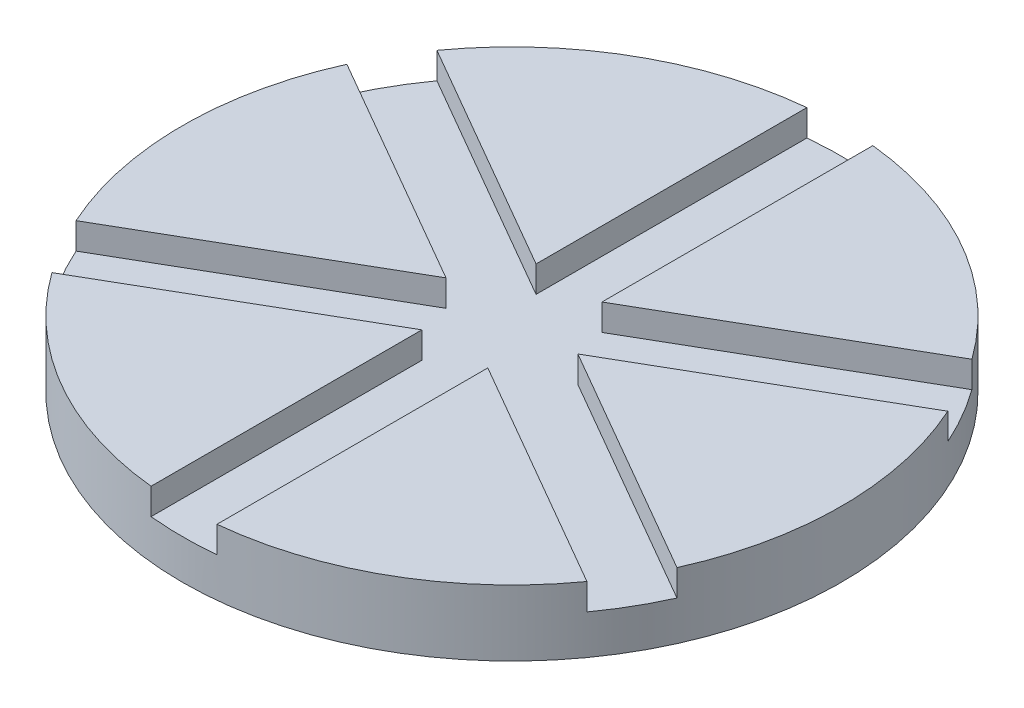
ISO-10303-21;
HEADER;
FILE_DESCRIPTION(('STEP AP214'),'2;1');
FILE_NAME('part.step','',(''),(''),'','','');
FILE_SCHEMA(('AUTOMOTIVE_DESIGN { 1 0 10303 214 1 1 1 1 }'));
ENDSEC;
DATA;
#1=APPLICATION_CONTEXT('core data for automotive mechanical design processes');
#2=APPLICATION_PROTOCOL_DEFINITION('international standard','automotive_design',2000,#1);
#3=PRODUCT_CONTEXT('',#1,'mechanical');
#4=PRODUCT('Part','Part','',(#3));
#5=PRODUCT_RELATED_PRODUCT_CATEGORY('part','',(#4));
#6=PRODUCT_DEFINITION_FORMATION('','',#4);
#7=PRODUCT_DEFINITION_CONTEXT('part definition',#1,'design');
#8=PRODUCT_DEFINITION('design','',#6,#7);
#9=PRODUCT_DEFINITION_SHAPE('','',#8);
#10=(LENGTH_UNIT() NAMED_UNIT(*) SI_UNIT(.MILLI.,.METRE.));
#11=(NAMED_UNIT(*) PLANE_ANGLE_UNIT() SI_UNIT($,.RADIAN.));
#12=(NAMED_UNIT(*) SI_UNIT($,.STERADIAN.) SOLID_ANGLE_UNIT());
#13=UNCERTAINTY_MEASURE_WITH_UNIT(LENGTH_MEASURE(1.E-05),#10,'distance_accuracy_value','');
#14=(GEOMETRIC_REPRESENTATION_CONTEXT(3) GLOBAL_UNCERTAINTY_ASSIGNED_CONTEXT((#13)) GLOBAL_UNIT_ASSIGNED_CONTEXT((#10,
#11,#12)) REPRESENTATION_CONTEXT('',''));
#15=CARTESIAN_POINT('',(0.,0.,0.));
#16=DIRECTION('',(0.,0.,1.));
#17=DIRECTION('',(1.,0.,0.));
#18=AXIS2_PLACEMENT_3D('',#15,#16,#17);
#19=CARTESIAN_POINT('',(0.,25.4,0.));
#20=DIRECTION('',(0.,1.,0.));
#21=DIRECTION('',(0.,0.,1.));
#22=AXIS2_PLACEMENT_3D('',#19,#20,#21);
#23=PLANE('',#22);
#24=DIRECTION('',(0.,0.,1.));
#25=VECTOR('',#24,1.);
#26=CARTESIAN_POINT('',(-12.7,25.4,127.));
#27=LINE('',#26,#25);
#28=CARTESIAN_POINT('',(-12.7000000000005,25.4,21.9970452561243));
#29=VERTEX_POINT('',#28);
#30=CARTESIAN_POINT('',(-12.7,25.4,126.363404512541));
#31=VERTEX_POINT('',#30);
#32=EDGE_CURVE('E167',#29,#31,#27,.T.);
#33=ORIENTED_EDGE('',*,*,#32,.F.);
#34=DIRECTION('',(0.866025403784438,0.,-0.5));
#35=VECTOR('',#34,1.);
#36=CARTESIAN_POINT('',(6.34999999999969,25.4,10.9985226280618));
#37=LINE('',#36,#35);
#38=CARTESIAN_POINT('',(-103.08391841655,25.4,74.1802248843323));
#39=VERTEX_POINT('',#38);
#40=EDGE_CURVE('E280',#39,#29,#37,.T.);
#41=ORIENTED_EDGE('',*,*,#40,.F.);
#42=CARTESIAN_POINT('',(0.,25.4,0.));
#43=DIRECTION('',(0.,1.,0.));
#44=DIRECTION('',(0.,0.,1.));
#45=AXIS2_PLACEMENT_3D('',#42,#43,#44);
#46=CIRCLE('',#45,127.);
#47=EDGE_CURVE('E268',#39,#31,#46,.T.);
#48=ORIENTED_EDGE('',*,*,#47,.T.);
#49=EDGE_LOOP('',(#33,#41,#48));
#50=FACE_BOUND('',#49,.T.);
#51=ADVANCED_FACE('F33',(#50),#23,.T.);
#52=DIRECTION('',(-0.866025403784439,0.,0.5));
#53=VECTOR('',#52,1.);
#54=CARTESIAN_POINT('',(-25.4000000000017,25.4,3.36536354339501E-13));
#55=LINE('',#54,#53);
#56=CARTESIAN_POINT('',(-25.4000000000017,25.4,3.36536354339501E-13));
#57=VERTEX_POINT('',#56);
#58=CARTESIAN_POINT('',(-115.78391841655,25.4,52.1831796282075));
#59=VERTEX_POINT('',#58);
#60=EDGE_CURVE('E216',#57,#59,#55,.T.);
#61=ORIENTED_EDGE('',*,*,#60,.F.);
#62=DIRECTION('',(0.866025403784439,0.,0.5));
#63=VECTOR('',#62,1.);
#64=CARTESIAN_POINT('',(-6.35000000000057,25.4,10.9985226280634));
#65=LINE('',#64,#63);
#66=CARTESIAN_POINT('',(-115.78391841655,25.4,-52.1831796282069));
#67=VERTEX_POINT('',#66);
#68=EDGE_CURVE('E278',#67,#57,#65,.T.);
#69=ORIENTED_EDGE('',*,*,#68,.F.);
#70=EDGE_CURVE('E354',#67,#59,#46,.T.);
#71=ORIENTED_EDGE('',*,*,#70,.T.);
#72=EDGE_LOOP('',(#61,#69,#71));
#73=FACE_BOUND('',#72,.T.);
#74=ADVANCED_FACE('F314',(#73),#23,.T.);
#75=DIRECTION('',(-0.866025403784439,0.,-0.5));
#76=VECTOR('',#75,1.);
#77=CARTESIAN_POINT('',(-103.635226280624,25.4,-74.4985226280613));
#78=LINE('',#77,#76);
#79=CARTESIAN_POINT('',(-12.7,25.4,-21.9970452561234));
#80=VERTEX_POINT('',#79);
#81=CARTESIAN_POINT('',(-103.08391841655,25.4,-74.1802248843318));
#82=VERTEX_POINT('',#81);
#83=EDGE_CURVE('E214',#80,#82,#78,.T.);
#84=ORIENTED_EDGE('',*,*,#83,.F.);
#85=DIRECTION('',(0.,0.,1.));
#86=VECTOR('',#85,1.);
#87=CARTESIAN_POINT('',(-12.7,25.4,0.));
#88=LINE('',#87,#86);
#89=CARTESIAN_POINT('',(-12.7,25.4,-126.363404512541));
#90=VERTEX_POINT('',#89);
#91=EDGE_CURVE('E276',#90,#80,#88,.T.);
#92=ORIENTED_EDGE('',*,*,#91,.F.);
#93=EDGE_CURVE('E350',#90,#82,#46,.T.);
#94=ORIENTED_EDGE('',*,*,#93,.T.);
#95=EDGE_LOOP('',(#84,#92,#94));
#96=FACE_BOUND('',#95,.T.);
#97=ADVANCED_FACE('F321',(#96),#23,.T.);
#98=DIRECTION('',(0.,0.,-1.));
#99=VECTOR('',#98,1.);
#100=CARTESIAN_POINT('',(12.7,25.4,-21.9970452561254));
#101=LINE('',#100,#99);
#102=CARTESIAN_POINT('',(12.7,25.4,-21.9970452561254));
#103=VERTEX_POINT('',#102);
#104=CARTESIAN_POINT('',(12.7,25.4,-126.363404512541));
#105=VERTEX_POINT('',#104);
#106=EDGE_CURVE('E212',#103,#105,#101,.T.);
#107=ORIENTED_EDGE('',*,*,#106,.F.);
#108=DIRECTION('',(-0.866025403784438,0.,0.5));
#109=VECTOR('',#108,1.);
#110=CARTESIAN_POINT('',(-6.35000000000028,25.4,-10.9985226280628));
#111=LINE('',#110,#109);
#112=CARTESIAN_POINT('',(103.083918416549,25.4,-74.1802248843332));
#113=VERTEX_POINT('',#112);
#114=EDGE_CURVE('E274',#113,#103,#111,.T.);
#115=ORIENTED_EDGE('',*,*,#114,.F.);
#116=EDGE_CURVE('E348',#113,#105,#46,.T.);
#117=ORIENTED_EDGE('',*,*,#116,.T.);
#118=EDGE_LOOP('',(#107,#115,#117));
#119=FACE_BOUND('',#118,.T.);
#120=ADVANCED_FACE('F334',(#119),#23,.T.);
#121=DIRECTION('',(0.866025403784437,0.,-0.500000000000004));
#122=VECTOR('',#121,1.);
#123=CARTESIAN_POINT('',(116.335226280623,25.4,-52.5014773719382));
#124=LINE('',#123,#122);
#125=CARTESIAN_POINT('',(25.3999999999986,25.4,5.93275428784068E-13));
#126=VERTEX_POINT('',#125);
#127=CARTESIAN_POINT('',(115.783918416549,25.4,-52.1831796282086));
#128=VERTEX_POINT('',#127);
#129=EDGE_CURVE('E209',#126,#128,#124,.T.);
#130=ORIENTED_EDGE('',*,*,#129,.F.);
#131=DIRECTION('',(-0.866025403784439,0.,-0.5));
#132=VECTOR('',#131,1.);
#133=CARTESIAN_POINT('',(6.34999999999939,25.4,-10.9985226280613));
#134=LINE('',#133,#132);
#135=CARTESIAN_POINT('',(115.783918416549,25.4,52.1831796282091));
#136=VERTEX_POINT('',#135);
#137=EDGE_CURVE('E272',#136,#126,#134,.T.);
#138=ORIENTED_EDGE('',*,*,#137,.F.);
#139=EDGE_CURVE('E267',#136,#128,#46,.T.);
#140=ORIENTED_EDGE('',*,*,#139,.T.);
#141=EDGE_LOOP('',(#130,#138,#140));
#142=FACE_BOUND('',#141,.T.);
#143=ADVANCED_FACE('F326',(#142),#23,.T.);
#144=CARTESIAN_POINT('',(0.,25.4,0.));
#145=DIRECTION('',(0.,-1.,0.));
#146=DIRECTION('',(0.,0.,-1.));
#147=AXIS2_PLACEMENT_3D('',#144,#145,#146);
#148=CYLINDRICAL_SURFACE('',#147,127.);
#149=ORIENTED_EDGE('',*,*,#116,.F.);
#150=DIRECTION('',(0.,-1.,0.));
#151=VECTOR('',#150,1.);
#152=CARTESIAN_POINT('',(103.083918416549,25.4,-74.1802248843332));
#153=LINE('',#152,#151);
#154=CARTESIAN_POINT('',(103.083918416549,15.24,-74.1802248843332));
#155=VERTEX_POINT('',#154);
#156=EDGE_CURVE('E241',#113,#155,#153,.T.);
#157=ORIENTED_EDGE('',*,*,#156,.T.);
#158=CARTESIAN_POINT('',(0.,15.24,0.));
#159=DIRECTION('',(0.,-1.,0.));
#160=DIRECTION('',(0.,0.,-1.));
#161=AXIS2_PLACEMENT_3D('',#158,#159,#160);
#162=CIRCLE('',#161,127.);
#163=CARTESIAN_POINT('',(115.783918416549,15.24,-52.1831796282085));
#164=VERTEX_POINT('',#163);
#165=EDGE_CURVE('E41',#155,#164,#162,.T.);
#166=ORIENTED_EDGE('',*,*,#165,.T.);
#167=DIRECTION('',(0.,-1.,0.));
#168=VECTOR('',#167,1.);
#169=CARTESIAN_POINT('',(115.783918416549,25.4,-52.1831796282085));
#170=LINE('',#169,#168);
#171=EDGE_CURVE('E238',#164,#128,#170,.F.);
#172=ORIENTED_EDGE('',*,*,#171,.T.);
#173=ORIENTED_EDGE('',*,*,#139,.F.);
#174=DIRECTION('',(0.,-1.,0.));
#175=VECTOR('',#174,1.);
#176=CARTESIAN_POINT('',(115.783918416549,25.4,52.1831796282091));
#177=LINE('',#176,#175);
#178=CARTESIAN_POINT('',(115.783918416549,15.24,52.1831796282091));
#179=VERTEX_POINT('',#178);
#180=EDGE_CURVE('E235',#136,#179,#177,.T.);
#181=ORIENTED_EDGE('',*,*,#180,.T.);
#182=CARTESIAN_POINT('',(103.083918416549,15.24,74.1802248843337));
#183=VERTEX_POINT('',#182);
#184=EDGE_CURVE('E288',#179,#183,#162,.T.);
#185=ORIENTED_EDGE('',*,*,#184,.T.);
#186=DIRECTION('',(0.,-1.,0.));
#187=VECTOR('',#186,1.);
#188=CARTESIAN_POINT('',(103.083918416549,25.4,74.1802248843337));
#189=LINE('',#188,#187);
#190=CARTESIAN_POINT('',(103.083918416549,25.4,74.1802248843337));
#191=VERTEX_POINT('',#190);
#192=EDGE_CURVE('E180',#183,#191,#189,.F.);
#193=ORIENTED_EDGE('',*,*,#192,.T.);
#194=CARTESIAN_POINT('',(12.7,25.4,126.363404512541));
#195=VERTEX_POINT('',#194);
#196=EDGE_CURVE('E264',#195,#191,#46,.T.);
#197=ORIENTED_EDGE('',*,*,#196,.F.);
#198=DIRECTION('',(0.,-1.,0.));
#199=VECTOR('',#198,1.);
#200=CARTESIAN_POINT('',(12.7,25.4,126.363404512541));
#201=LINE('',#200,#199);
#202=CARTESIAN_POINT('',(12.7,15.24,126.363404512541));
#203=VERTEX_POINT('',#202);
#204=EDGE_CURVE('E48',#195,#203,#201,.T.);
#205=ORIENTED_EDGE('',*,*,#204,.T.);
#206=CARTESIAN_POINT('',(-12.7,15.24,126.363404512541));
#207=VERTEX_POINT('',#206);
#208=EDGE_CURVE('E166',#203,#207,#162,.T.);
#209=ORIENTED_EDGE('',*,*,#208,.T.);
#210=DIRECTION('',(0.,-1.,0.));
#211=VECTOR('',#210,1.);
#212=CARTESIAN_POINT('',(-12.7,25.4,126.363404512541));
#213=LINE('',#212,#211);
#214=EDGE_CURVE('E56',#207,#31,#213,.F.);
#215=ORIENTED_EDGE('',*,*,#214,.T.);
#216=ORIENTED_EDGE('',*,*,#47,.F.);
#217=DIRECTION('',(0.,-1.,0.));
#218=VECTOR('',#217,1.);
#219=CARTESIAN_POINT('',(-103.08391841655,25.4,74.1802248843323));
#220=LINE('',#219,#218);
#221=CARTESIAN_POINT('',(-103.08391841655,15.24,74.1802248843323));
#222=VERTEX_POINT('',#221);
#223=EDGE_CURVE('E259',#39,#222,#220,.T.);
#224=ORIENTED_EDGE('',*,*,#223,.T.);
#225=CARTESIAN_POINT('',(-115.78391841655,15.24,52.1831796282075));
#226=VERTEX_POINT('',#225);
#227=EDGE_CURVE('E286',#222,#226,#162,.T.);
#228=ORIENTED_EDGE('',*,*,#227,.T.);
#229=DIRECTION('',(0.,-1.,0.));
#230=VECTOR('',#229,1.);
#231=CARTESIAN_POINT('',(-115.78391841655,25.4,52.1831796282075));
#232=LINE('',#231,#230);
#233=EDGE_CURVE('E256',#226,#59,#232,.F.);
#234=ORIENTED_EDGE('',*,*,#233,.T.);
#235=ORIENTED_EDGE('',*,*,#70,.F.);
#236=DIRECTION('',(0.,-1.,0.));
#237=VECTOR('',#236,1.);
#238=CARTESIAN_POINT('',(-115.78391841655,25.4,-52.1831796282069));
#239=LINE('',#238,#237);
#240=CARTESIAN_POINT('',(-115.78391841655,15.24,-52.1831796282069));
#241=VERTEX_POINT('',#240);
#242=EDGE_CURVE('E253',#67,#241,#239,.T.);
#243=ORIENTED_EDGE('',*,*,#242,.T.);
#244=CARTESIAN_POINT('',(-103.08391841655,15.24,-74.1802248843318));
#245=VERTEX_POINT('',#244);
#246=EDGE_CURVE('E283',#241,#245,#162,.T.);
#247=ORIENTED_EDGE('',*,*,#246,.T.);
#248=DIRECTION('',(0.,-1.,0.));
#249=VECTOR('',#248,1.);
#250=CARTESIAN_POINT('',(-103.08391841655,25.4,-74.1802248843318));
#251=LINE('',#250,#249);
#252=EDGE_CURVE('E250',#245,#82,#251,.F.);
#253=ORIENTED_EDGE('',*,*,#252,.T.);
#254=ORIENTED_EDGE('',*,*,#93,.F.);
#255=DIRECTION('',(0.,-1.,0.));
#256=VECTOR('',#255,1.);
#257=CARTESIAN_POINT('',(-12.7,25.4,-126.363404512541));
#258=LINE('',#257,#256);
#259=CARTESIAN_POINT('',(-12.7,15.24,-126.363404512541));
#260=VERTEX_POINT('',#259);
#261=EDGE_CURVE('E247',#90,#260,#258,.T.);
#262=ORIENTED_EDGE('',*,*,#261,.T.);
#263=CARTESIAN_POINT('',(12.7,15.24,-126.363404512541));
#264=VERTEX_POINT('',#263);
#265=EDGE_CURVE('E281',#260,#264,#162,.T.);
#266=ORIENTED_EDGE('',*,*,#265,.T.);
#267=DIRECTION('',(0.,-1.,0.));
#268=VECTOR('',#267,1.);
#269=CARTESIAN_POINT('',(12.7,25.4,-126.363404512541));
#270=LINE('',#269,#268);
#271=EDGE_CURVE('E244',#264,#105,#270,.F.);
#272=ORIENTED_EDGE('',*,*,#271,.T.);
#273=EDGE_LOOP('',(#149,#157,#166,#172,#173,#181,#185,#193,#197,#205,#209,#215,#216,#224,#228,
#234,#235,#243,#247,#253,#254,#262,#266,#272));
#274=FACE_BOUND('',#273,.T.);
#275=CARTESIAN_POINT('',(0.,0.,0.));
#276=DIRECTION('',(0.,1.,0.));
#277=DIRECTION('',(0.,0.,1.));
#278=AXIS2_PLACEMENT_3D('',#275,#276,#277);
#279=CIRCLE('',#278,127.);
#280=CARTESIAN_POINT('',(0.,0.,127.));
#281=VERTEX_POINT('',#280);
#282=EDGE_CURVE('E263',#281,#281,#279,.T.);
#283=ORIENTED_EDGE('',*,*,#282,.T.);
#284=EDGE_LOOP('',(#283));
#285=FACE_BOUND('',#284,.T.);
#286=ADVANCED_FACE('F35',(#274,#285),#148,.T.);
#287=DIRECTION('',(0.866025403784439,0.,0.5));
#288=VECTOR('',#287,1.);
#289=CARTESIAN_POINT('',(12.7,25.4,21.9970452561261));
#290=LINE('',#289,#288);
#291=CARTESIAN_POINT('',(12.7,25.4,21.9970452561261));
#292=VERTEX_POINT('',#291);
#293=EDGE_CURVE('E207',#292,#191,#290,.T.);
#294=ORIENTED_EDGE('',*,*,#293,.F.);
#295=DIRECTION('',(0.,0.,-1.));
#296=VECTOR('',#295,1.);
#297=CARTESIAN_POINT('',(12.7,25.4,0.));
#298=LINE('',#297,#296);
#299=EDGE_CURVE('E172',#195,#292,#298,.T.);
#300=ORIENTED_EDGE('',*,*,#299,.F.);
#301=ORIENTED_EDGE('',*,*,#196,.T.);
#302=EDGE_LOOP('',(#294,#300,#301));
#303=FACE_BOUND('',#302,.T.);
#304=ADVANCED_FACE('F317',(#303),#23,.T.);
#305=CARTESIAN_POINT('',(0.,0.,0.));
#306=DIRECTION('',(0.,1.,0.));
#307=DIRECTION('',(0.,0.,1.));
#308=AXIS2_PLACEMENT_3D('',#305,#306,#307);
#309=PLANE('',#308);
#310=CARTESIAN_POINT('',(0.,0.,0.));
#311=DIRECTION('',(0.,1.,0.));
#312=DIRECTION('',(0.,0.,1.));
#313=AXIS2_PLACEMENT_3D('',#310,#311,#312);
#314=CIRCLE('',#313,12.7);
#315=CARTESIAN_POINT('',(0.,0.,12.7));
#316=VERTEX_POINT('',#315);
#317=EDGE_CURVE('E11',#316,#316,#314,.F.);
#318=ORIENTED_EDGE('',*,*,#317,.F.);
#319=EDGE_LOOP('',(#318));
#320=FACE_BOUND('',#319,.T.);
#321=ORIENTED_EDGE('',*,*,#282,.F.);
#322=EDGE_LOOP('',(#321));
#323=FACE_BOUND('',#322,.T.);
#324=ADVANCED_FACE('F311',(#320,#323),#309,.F.);
#325=CARTESIAN_POINT('',(0.,15.24,0.));
#326=DIRECTION('',(0.,-1.,0.));
#327=DIRECTION('',(0.,0.,-1.));
#328=AXIS2_PLACEMENT_3D('',#325,#326,#327);
#329=PLANE('',#328);
#330=DIRECTION('',(-0.866025403784438,0.,0.5));
#331=VECTOR('',#330,1.);
#332=CARTESIAN_POINT('',(103.635226280623,15.24,-74.4985226280629));
#333=LINE('',#332,#331);
#334=CARTESIAN_POINT('',(12.7,15.24,-21.9970452561254));
#335=VERTEX_POINT('',#334);
#336=EDGE_CURVE('E189',#155,#335,#333,.T.);
#337=ORIENTED_EDGE('',*,*,#336,.T.);
#338=DIRECTION('',(0.,0.,-1.));
#339=VECTOR('',#338,1.);
#340=CARTESIAN_POINT('',(12.7,15.24,-21.9970452561254));
#341=LINE('',#340,#339);
#342=EDGE_CURVE('E191',#335,#264,#341,.T.);
#343=ORIENTED_EDGE('',*,*,#342,.T.);
#344=ORIENTED_EDGE('',*,*,#265,.F.);
#345=DIRECTION('',(0.,0.,1.));
#346=VECTOR('',#345,1.);
#347=CARTESIAN_POINT('',(-12.7,15.24,-21.9970452561234));
#348=LINE('',#347,#346);
#349=CARTESIAN_POINT('',(-12.7,15.24,-21.9970452561234));
#350=VERTEX_POINT('',#349);
#351=EDGE_CURVE('E194',#260,#350,#348,.T.);
#352=ORIENTED_EDGE('',*,*,#351,.T.);
#353=DIRECTION('',(-0.866025403784439,0.,-0.5));
#354=VECTOR('',#353,1.);
#355=CARTESIAN_POINT('',(-103.635226280624,15.24,-74.4985226280613));
#356=LINE('',#355,#354);
#357=EDGE_CURVE('E196',#350,#245,#356,.T.);
#358=ORIENTED_EDGE('',*,*,#357,.T.);
#359=ORIENTED_EDGE('',*,*,#246,.F.);
#360=DIRECTION('',(0.866025403784439,0.,0.5));
#361=VECTOR('',#360,1.);
#362=CARTESIAN_POINT('',(-116.335226280624,15.24,-52.5014773719366));
#363=LINE('',#362,#361);
#364=CARTESIAN_POINT('',(-25.4000000000017,15.24,3.36536354339501E-13));
#365=VERTEX_POINT('',#364);
#366=EDGE_CURVE('E199',#241,#365,#363,.T.);
#367=ORIENTED_EDGE('',*,*,#366,.T.);
#368=DIRECTION('',(-0.866025403784439,0.,0.5));
#369=VECTOR('',#368,1.);
#370=CARTESIAN_POINT('',(-25.4000000000017,15.24,3.36536354339501E-13));
#371=LINE('',#370,#369);
#372=EDGE_CURVE('E201',#365,#226,#371,.T.);
#373=ORIENTED_EDGE('',*,*,#372,.T.);
#374=ORIENTED_EDGE('',*,*,#227,.F.);
#375=DIRECTION('',(0.866025403784438,0.,-0.5));
#376=VECTOR('',#375,1.);
#377=CARTESIAN_POINT('',(-12.7000000000005,15.24,21.9970452561243));
#378=LINE('',#377,#376);
#379=CARTESIAN_POINT('',(-12.7000000000005,15.24,21.9970452561243));
#380=VERTEX_POINT('',#379);
#381=EDGE_CURVE('E204',#222,#380,#378,.T.);
#382=ORIENTED_EDGE('',*,*,#381,.T.);
#383=DIRECTION('',(0.,0.,1.));
#384=VECTOR('',#383,1.);
#385=CARTESIAN_POINT('',(-12.7,15.24,127.));
#386=LINE('',#385,#384);
#387=EDGE_CURVE('E176',#380,#207,#386,.T.);
#388=ORIENTED_EDGE('',*,*,#387,.T.);
#389=ORIENTED_EDGE('',*,*,#208,.F.);
#390=DIRECTION('',(0.,0.,-1.));
#391=VECTOR('',#390,1.);
#392=CARTESIAN_POINT('',(12.7,15.24,127.));
#393=LINE('',#392,#391);
#394=CARTESIAN_POINT('',(12.7,15.24,21.9970452561261));
#395=VERTEX_POINT('',#394);
#396=EDGE_CURVE('E159',#203,#395,#393,.T.);
#397=ORIENTED_EDGE('',*,*,#396,.T.);
#398=DIRECTION('',(0.866025403784439,0.,0.5));
#399=VECTOR('',#398,1.);
#400=CARTESIAN_POINT('',(12.7,15.24,21.9970452561261));
#401=LINE('',#400,#399);
#402=EDGE_CURVE('E163',#395,#183,#401,.T.);
#403=ORIENTED_EDGE('',*,*,#402,.T.);
#404=ORIENTED_EDGE('',*,*,#184,.F.);
#405=DIRECTION('',(-0.866025403784439,0.,-0.5));
#406=VECTOR('',#405,1.);
#407=CARTESIAN_POINT('',(25.3999999999986,15.24,5.93275428784068E-13));
#408=LINE('',#407,#406);
#409=CARTESIAN_POINT('',(25.3999999999986,15.24,5.93275428784068E-13));
#410=VERTEX_POINT('',#409);
#411=EDGE_CURVE('E181',#179,#410,#408,.T.);
#412=ORIENTED_EDGE('',*,*,#411,.T.);
#413=DIRECTION('',(0.866025403784437,0.,-0.500000000000004));
#414=VECTOR('',#413,1.);
#415=CARTESIAN_POINT('',(116.335226280623,15.24,-52.5014773719382));
#416=LINE('',#415,#414);
#417=EDGE_CURVE('E183',#410,#164,#416,.T.);
#418=ORIENTED_EDGE('',*,*,#417,.T.);
#419=ORIENTED_EDGE('',*,*,#165,.F.);
#420=EDGE_LOOP('',(#337,#343,#344,#352,#358,#359,#367,#373,#374,#382,#388,#389,#397,#403,#404,
#412,#418,#419));
#421=FACE_BOUND('',#420,.T.);
#422=ADVANCED_FACE('F161',(#421),#329,.F.);
#423=CARTESIAN_POINT('',(-12.7,15.24,127.));
#424=DIRECTION('',(-1.,0.,0.));
#425=DIRECTION('',(0.,0.,1.));
#426=AXIS2_PLACEMENT_3D('',#423,#424,#425);
#427=PLANE('',#426);
#428=ORIENTED_EDGE('',*,*,#387,.F.);
#429=DIRECTION('',(0.,1.,0.));
#430=VECTOR('',#429,1.);
#431=CARTESIAN_POINT('',(-12.7000000000005,15.24,21.9970452561243));
#432=LINE('',#431,#430);
#433=EDGE_CURVE('E219',#380,#29,#432,.T.);
#434=ORIENTED_EDGE('',*,*,#433,.T.);
#435=ORIENTED_EDGE('',*,*,#32,.T.);
#436=ORIENTED_EDGE('',*,*,#214,.F.);
#437=EDGE_LOOP('',(#428,#434,#435,#436));
#438=FACE_BOUND('',#437,.T.);
#439=ADVANCED_FACE('F302',(#438),#427,.F.);
#440=CARTESIAN_POINT('',(-12.7000000000005,15.24,21.9970452561243));
#441=DIRECTION('',(0.5,0.,0.866025403784438));
#442=DIRECTION('',(0.866025403784438,0.,-0.5));
#443=AXIS2_PLACEMENT_3D('',#440,#441,#442);
#444=PLANE('',#443);
#445=ORIENTED_EDGE('',*,*,#40,.T.);
#446=ORIENTED_EDGE('',*,*,#433,.F.);
#447=ORIENTED_EDGE('',*,*,#381,.F.);
#448=ORIENTED_EDGE('',*,*,#223,.F.);
#449=EDGE_LOOP('',(#445,#446,#447,#448));
#450=FACE_BOUND('',#449,.T.);
#451=ADVANCED_FACE('F299',(#450),#444,.F.);
#452=CARTESIAN_POINT('',(-25.4000000000017,15.24,3.36536354339501E-13));
#453=DIRECTION('',(-0.5,0.,-0.866025403784439));
#454=DIRECTION('',(-0.866025403784439,0.,0.5));
#455=AXIS2_PLACEMENT_3D('',#452,#453,#454);
#456=PLANE('',#455);
#457=ORIENTED_EDGE('',*,*,#372,.F.);
#458=DIRECTION('',(0.,1.,0.));
#459=VECTOR('',#458,1.);
#460=CARTESIAN_POINT('',(-25.4000000000017,15.24,3.36536354339501E-13));
#461=LINE('',#460,#459);
#462=EDGE_CURVE('E222',#365,#57,#461,.T.);
#463=ORIENTED_EDGE('',*,*,#462,.T.);
#464=ORIENTED_EDGE('',*,*,#60,.T.);
#465=ORIENTED_EDGE('',*,*,#233,.F.);
#466=EDGE_LOOP('',(#457,#463,#464,#465));
#467=FACE_BOUND('',#466,.T.);
#468=ADVANCED_FACE('F309',(#467),#456,.F.);
#469=CARTESIAN_POINT('',(-116.335226280624,15.24,-52.5014773719366));
#470=DIRECTION('',(-0.5,0.,0.866025403784439));
#471=DIRECTION('',(0.866025403784439,0.,0.5));
#472=AXIS2_PLACEMENT_3D('',#469,#470,#471);
#473=PLANE('',#472);
#474=ORIENTED_EDGE('',*,*,#68,.T.);
#475=ORIENTED_EDGE('',*,*,#462,.F.);
#476=ORIENTED_EDGE('',*,*,#366,.F.);
#477=ORIENTED_EDGE('',*,*,#242,.F.);
#478=EDGE_LOOP('',(#474,#475,#476,#477));
#479=FACE_BOUND('',#478,.T.);
#480=ADVANCED_FACE('F364',(#479),#473,.F.);
#481=CARTESIAN_POINT('',(-103.635226280624,15.24,-74.4985226280613));
#482=DIRECTION('',(0.5,0.,-0.866025403784439));
#483=DIRECTION('',(-0.866025403784439,0.,-0.5));
#484=AXIS2_PLACEMENT_3D('',#481,#482,#483);
#485=PLANE('',#484);
#486=ORIENTED_EDGE('',*,*,#357,.F.);
#487=DIRECTION('',(0.,1.,0.));
#488=VECTOR('',#487,1.);
#489=CARTESIAN_POINT('',(-12.7,15.24,-21.9970452561234));
#490=LINE('',#489,#488);
#491=EDGE_CURVE('E225',#350,#80,#490,.T.);
#492=ORIENTED_EDGE('',*,*,#491,.T.);
#493=ORIENTED_EDGE('',*,*,#83,.T.);
#494=ORIENTED_EDGE('',*,*,#252,.F.);
#495=EDGE_LOOP('',(#486,#492,#493,#494));
#496=FACE_BOUND('',#495,.T.);
#497=ADVANCED_FACE('F370',(#496),#485,.F.);
#498=CARTESIAN_POINT('',(-12.7,15.24,-21.9970452561234));
#499=DIRECTION('',(-1.,0.,0.));
#500=DIRECTION('',(0.,0.,1.));
#501=AXIS2_PLACEMENT_3D('',#498,#499,#500);
#502=PLANE('',#501);
#503=ORIENTED_EDGE('',*,*,#91,.T.);
#504=ORIENTED_EDGE('',*,*,#491,.F.);
#505=ORIENTED_EDGE('',*,*,#351,.F.);
#506=ORIENTED_EDGE('',*,*,#261,.F.);
#507=EDGE_LOOP('',(#503,#504,#505,#506));
#508=FACE_BOUND('',#507,.T.);
#509=ADVANCED_FACE('F372',(#508),#502,.F.);
#510=CARTESIAN_POINT('',(12.7,15.24,-21.9970452561254));
#511=DIRECTION('',(1.,0.,0.));
#512=DIRECTION('',(0.,0.,-1.));
#513=AXIS2_PLACEMENT_3D('',#510,#511,#512);
#514=PLANE('',#513);
#515=ORIENTED_EDGE('',*,*,#342,.F.);
#516=DIRECTION('',(0.,1.,0.));
#517=VECTOR('',#516,1.);
#518=CARTESIAN_POINT('',(12.7,15.24,-21.9970452561254));
#519=LINE('',#518,#517);
#520=EDGE_CURVE('E228',#335,#103,#519,.T.);
#521=ORIENTED_EDGE('',*,*,#520,.T.);
#522=ORIENTED_EDGE('',*,*,#106,.T.);
#523=ORIENTED_EDGE('',*,*,#271,.F.);
#524=EDGE_LOOP('',(#515,#521,#522,#523));
#525=FACE_BOUND('',#524,.T.);
#526=ADVANCED_FACE('F448',(#525),#514,.F.);
#527=CARTESIAN_POINT('',(103.635226280623,15.24,-74.4985226280629));
#528=DIRECTION('',(-0.5,0.,-0.866025403784438));
#529=DIRECTION('',(-0.866025403784438,0.,0.5));
#530=AXIS2_PLACEMENT_3D('',#527,#528,#529);
#531=PLANE('',#530);
#532=ORIENTED_EDGE('',*,*,#114,.T.);
#533=ORIENTED_EDGE('',*,*,#520,.F.);
#534=ORIENTED_EDGE('',*,*,#336,.F.);
#535=ORIENTED_EDGE('',*,*,#156,.F.);
#536=EDGE_LOOP('',(#532,#533,#534,#535));
#537=FACE_BOUND('',#536,.T.);
#538=ADVANCED_FACE('F457',(#537),#531,.F.);
#539=CARTESIAN_POINT('',(116.335226280623,15.24,-52.5014773719382));
#540=DIRECTION('',(0.500000000000003,0.,0.866025403784437));
#541=DIRECTION('',(0.866025403784437,0.,-0.500000000000004));
#542=AXIS2_PLACEMENT_3D('',#539,#540,#541);
#543=PLANE('',#542);
#544=ORIENTED_EDGE('',*,*,#417,.F.);
#545=DIRECTION('',(0.,1.,0.));
#546=VECTOR('',#545,1.);
#547=CARTESIAN_POINT('',(25.3999999999986,15.24,5.93275428784068E-13));
#548=LINE('',#547,#546);
#549=EDGE_CURVE('E175',#410,#126,#548,.T.);
#550=ORIENTED_EDGE('',*,*,#549,.T.);
#551=ORIENTED_EDGE('',*,*,#129,.T.);
#552=ORIENTED_EDGE('',*,*,#171,.F.);
#553=EDGE_LOOP('',(#544,#550,#551,#552));
#554=FACE_BOUND('',#553,.T.);
#555=ADVANCED_FACE('F346',(#554),#543,.F.);
#556=CARTESIAN_POINT('',(25.3999999999986,15.24,5.93275428784068E-13));
#557=DIRECTION('',(0.5,0.,-0.866025403784439));
#558=DIRECTION('',(-0.866025403784439,0.,-0.5));
#559=AXIS2_PLACEMENT_3D('',#556,#557,#558);
#560=PLANE('',#559);
#561=ORIENTED_EDGE('',*,*,#137,.T.);
#562=ORIENTED_EDGE('',*,*,#549,.F.);
#563=ORIENTED_EDGE('',*,*,#411,.F.);
#564=ORIENTED_EDGE('',*,*,#180,.F.);
#565=EDGE_LOOP('',(#561,#562,#563,#564));
#566=FACE_BOUND('',#565,.T.);
#567=ADVANCED_FACE('F476',(#566),#560,.F.);
#568=CARTESIAN_POINT('',(12.7,15.24,21.9970452561261));
#569=DIRECTION('',(-0.5,0.,0.866025403784439));
#570=DIRECTION('',(0.866025403784439,0.,0.5));
#571=AXIS2_PLACEMENT_3D('',#568,#569,#570);
#572=PLANE('',#571);
#573=ORIENTED_EDGE('',*,*,#402,.F.);
#574=DIRECTION('',(0.,1.,0.));
#575=VECTOR('',#574,1.);
#576=CARTESIAN_POINT('',(12.7,15.24,21.9970452561261));
#577=LINE('',#576,#575);
#578=EDGE_CURVE('E170',#395,#292,#577,.T.);
#579=ORIENTED_EDGE('',*,*,#578,.T.);
#580=ORIENTED_EDGE('',*,*,#293,.T.);
#581=ORIENTED_EDGE('',*,*,#192,.F.);
#582=EDGE_LOOP('',(#573,#579,#580,#581));
#583=FACE_BOUND('',#582,.T.);
#584=ADVANCED_FACE('F178',(#583),#572,.F.);
#585=CARTESIAN_POINT('',(12.7,15.24,127.));
#586=DIRECTION('',(1.,0.,0.));
#587=DIRECTION('',(0.,0.,-1.));
#588=AXIS2_PLACEMENT_3D('',#585,#586,#587);
#589=PLANE('',#588);
#590=ORIENTED_EDGE('',*,*,#299,.T.);
#591=ORIENTED_EDGE('',*,*,#578,.F.);
#592=ORIENTED_EDGE('',*,*,#396,.F.);
#593=ORIENTED_EDGE('',*,*,#204,.F.);
#594=EDGE_LOOP('',(#590,#591,#592,#593));
#595=FACE_BOUND('',#594,.T.);
#596=ADVANCED_FACE('F171',(#595),#589,.F.);
#597=CARTESIAN_POINT('',(0.,-38.1,0.));
#598=DIRECTION('',(0.,1.,0.));
#599=DIRECTION('',(0.,0.,1.));
#600=AXIS2_PLACEMENT_3D('',#597,#598,#599);
#601=CYLINDRICAL_SURFACE('',#600,12.7);
#602=CARTESIAN_POINT('',(0.,-38.1,0.));
#603=DIRECTION('',(0.,-1.,0.));
#604=DIRECTION('',(0.,0.,-1.));
#605=AXIS2_PLACEMENT_3D('',#602,#603,#604);
#606=CIRCLE('',#605,12.7);
#607=CARTESIAN_POINT('',(0.,-38.1,12.7));
#608=VERTEX_POINT('',#607);
#609=EDGE_CURVE('E210',#608,#608,#606,.T.);
#610=CARTESIAN_POINT('',(0.,-38.1,12.7));
#611=CARTESIAN_POINT('',(0.,-37.703125,12.7));
#612=CARTESIAN_POINT('',(0.,-37.30625,12.7));
#613=CARTESIAN_POINT('',(0.,-36.5125,12.7));
#614=CARTESIAN_POINT('',(0.,-36.115625,12.7));
#615=CARTESIAN_POINT('',(0.,-35.321875,12.7));
#616=CARTESIAN_POINT('',(0.,-34.925,12.7));
#617=CARTESIAN_POINT('',(0.,-34.13125,12.7));
#618=CARTESIAN_POINT('',(0.,-33.734375,12.7));
#619=CARTESIAN_POINT('',(0.,-32.940625,12.7));
#620=CARTESIAN_POINT('',(0.,-32.54375,12.7));
#621=CARTESIAN_POINT('',(0.,-31.75,12.7));
#622=CARTESIAN_POINT('',(0.,-31.353125,12.7));
#623=CARTESIAN_POINT('',(0.,-30.559375,12.7));
#624=CARTESIAN_POINT('',(0.,-30.1625,12.7));
#625=CARTESIAN_POINT('',(0.,-29.36875,12.7));
#626=CARTESIAN_POINT('',(0.,-28.971875,12.7));
#627=CARTESIAN_POINT('',(0.,-28.178125,12.7));
#628=CARTESIAN_POINT('',(0.,-27.78125,12.7));
#629=CARTESIAN_POINT('',(0.,-26.9875,12.7));
#630=CARTESIAN_POINT('',(0.,-26.590625,12.7));
#631=CARTESIAN_POINT('',(0.,-25.796875,12.7));
#632=CARTESIAN_POINT('',(0.,-25.4,12.7));
#633=CARTESIAN_POINT('',(0.,-24.60625,12.7));
#634=CARTESIAN_POINT('',(0.,-24.209375,12.7));
#635=CARTESIAN_POINT('',(0.,-23.415625,12.7));
#636=CARTESIAN_POINT('',(0.,-23.01875,12.7));
#637=CARTESIAN_POINT('',(0.,-22.225,12.7));
#638=CARTESIAN_POINT('',(0.,-21.828125,12.7));
#639=CARTESIAN_POINT('',(0.,-21.034375,12.7));
#640=CARTESIAN_POINT('',(0.,-20.6375,12.7));
#641=CARTESIAN_POINT('',(0.,-19.84375,12.7));
#642=CARTESIAN_POINT('',(0.,-19.446875,12.7));
#643=CARTESIAN_POINT('',(0.,-18.653125,12.7));
#644=CARTESIAN_POINT('',(0.,-18.25625,12.7));
#645=CARTESIAN_POINT('',(0.,-17.4625,12.7));
#646=CARTESIAN_POINT('',(0.,-17.065625,12.7));
#647=CARTESIAN_POINT('',(0.,-16.271875,12.7));
#648=CARTESIAN_POINT('',(0.,-15.875,12.7));
#649=CARTESIAN_POINT('',(0.,-15.08125,12.7));
#650=CARTESIAN_POINT('',(0.,-14.684375,12.7));
#651=CARTESIAN_POINT('',(0.,-13.890625,12.7));
#652=CARTESIAN_POINT('',(0.,-13.49375,12.7));
#653=CARTESIAN_POINT('',(0.,-12.7,12.7));
#654=CARTESIAN_POINT('',(0.,-12.303125,12.7));
#655=CARTESIAN_POINT('',(0.,-11.509375,12.7));
#656=CARTESIAN_POINT('',(0.,-11.1125,12.7));
#657=CARTESIAN_POINT('',(0.,-10.31875,12.7));
#658=CARTESIAN_POINT('',(0.,-9.92187499999999,12.7));
#659=CARTESIAN_POINT('',(0.,-9.128125,12.7));
#660=CARTESIAN_POINT('',(0.,-8.73124999999999,12.7));
#661=CARTESIAN_POINT('',(0.,-7.93749999999999,12.7));
#662=CARTESIAN_POINT('',(0.,-7.54062499999999,12.7));
#663=CARTESIAN_POINT('',(0.,-6.746875,12.7));
#664=CARTESIAN_POINT('',(0.,-6.35,12.7));
#665=CARTESIAN_POINT('',(0.,-5.55625,12.7));
#666=CARTESIAN_POINT('',(0.,-5.159375,12.7));
#667=CARTESIAN_POINT('',(0.,-4.365625,12.7));
#668=CARTESIAN_POINT('',(0.,-3.96875,12.7));
#669=CARTESIAN_POINT('',(0.,-3.175,12.7));
#670=CARTESIAN_POINT('',(0.,-2.778125,12.7));
#671=CARTESIAN_POINT('',(0.,-1.984375,12.7));
#672=CARTESIAN_POINT('',(0.,-1.5875,12.7));
#673=CARTESIAN_POINT('',(0.,-0.79375,12.7));
#674=CARTESIAN_POINT('',(0.,-0.396875,12.7));
#675=CARTESIAN_POINT('',(0.,0.,12.7));
#676=B_SPLINE_CURVE_WITH_KNOTS('',3,(#610,#611,#612,#613,#614,#615,#616,#617,#618,#619,#620,
#621,#622,#623,#624,#625,#626,#627,#628,#629,#630,#631,#632,#633,#634,#635,#636,#637,#638,#639,
#640,#641,#642,#643,#644,#645,#646,#647,#648,#649,#650,#651,#652,#653,#654,#655,#656,#657,#658,
#659,#660,#661,#662,#663,#664,#665,#666,#667,#668,#669,#670,#671,#672,#673,#674,#675),
.UNSPECIFIED.,.F.,.F.,(4,2,2,2,2,2,2,2,2,2,2,2,2,2,2,2,2,2,2,2,2,2,2,2,2,2,2,2,2,2,2,2,4),(0.,
1.190625,2.38125,3.571875,4.7625,5.953125,7.14375,8.334375,9.52500000000001,10.715625,11.90625,
13.096875,14.2875,15.478125,16.66875,17.859375,19.05,20.240625,21.43125,22.621875,23.8125,
25.003125,26.19375,27.384375,28.575,29.765625,30.95625,32.146875,33.3375,34.528125,35.71875,
36.909375,38.1),.UNSPECIFIED.);
#677=EDGE_CURVE('BSEAM502',#608,#316,#676,.T.);
#678=ORIENTED_EDGE('',*,*,#609,.F.);
#679=ORIENTED_EDGE('',*,*,#317,.T.);
#680=ORIENTED_EDGE('',*,*,#677,.T.);
#681=ORIENTED_EDGE('',*,*,#677,.F.);
#682=EDGE_LOOP('',(#678,#680,#679,#681));
#683=FACE_BOUND('',#682,.T.);
#684=ADVANCED_FACE('F502',(#683),#601,.T.);
#685=CARTESIAN_POINT('',(0.,-38.1,0.));
#686=DIRECTION('',(0.,-1.,0.));
#687=DIRECTION('',(0.,0.,-1.));
#688=AXIS2_PLACEMENT_3D('',#685,#686,#687);
#689=PLANE('',#688);
#690=ORIENTED_EDGE('',*,*,#609,.T.);
#691=EDGE_LOOP('',(#690));
#692=FACE_BOUND('',#691,.T.);
#693=ADVANCED_FACE('F513',(#692),#689,.T.);
#694=CLOSED_SHELL('',(#51,#74,#97,#120,#143,#286,#304,#324,#422,#439,#451,#468,#480,#497,#509,
#526,#538,#555,#567,#584,#596,#684,#693));
#695=MANIFOLD_SOLID_BREP('B2',#694);
#696=ADVANCED_BREP_SHAPE_REPRESENTATION('',(#18,#695),#14);
#697=SHAPE_DEFINITION_REPRESENTATION(#9,#696);
ENDSEC;
END-ISO-10303-21;
